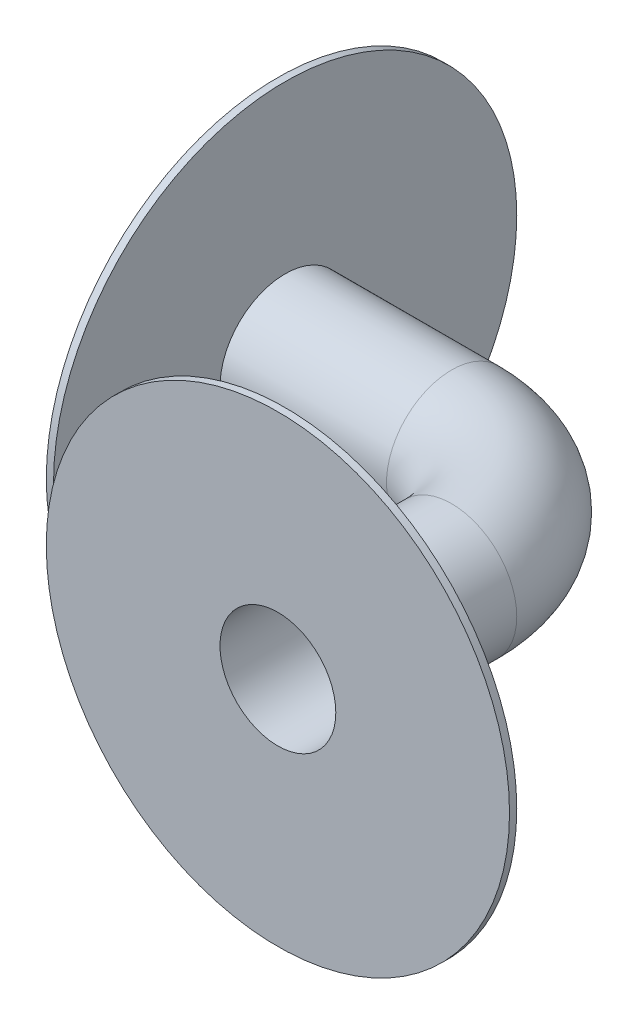
ISO-10303-21;
HEADER;
FILE_DESCRIPTION(('STEP AP214'),'2;1');
FILE_NAME('part.step','',(''),(''),'','','');
FILE_SCHEMA(('AUTOMOTIVE_DESIGN { 1 0 10303 214 1 1 1 1 }'));
ENDSEC;
DATA;
#1=APPLICATION_CONTEXT('core data for automotive mechanical design processes');
#2=APPLICATION_PROTOCOL_DEFINITION('international standard','automotive_design',2000,#1);
#3=PRODUCT_CONTEXT('',#1,'mechanical');
#4=PRODUCT('Part','Part','',(#3));
#5=PRODUCT_RELATED_PRODUCT_CATEGORY('part','',(#4));
#6=PRODUCT_DEFINITION_FORMATION('','',#4);
#7=PRODUCT_DEFINITION_CONTEXT('part definition',#1,'design');
#8=PRODUCT_DEFINITION('design','',#6,#7);
#9=PRODUCT_DEFINITION_SHAPE('','',#8);
#10=(LENGTH_UNIT() NAMED_UNIT(*) SI_UNIT(.MILLI.,.METRE.));
#11=(NAMED_UNIT(*) PLANE_ANGLE_UNIT() SI_UNIT($,.RADIAN.));
#12=(NAMED_UNIT(*) SI_UNIT($,.STERADIAN.) SOLID_ANGLE_UNIT());
#13=UNCERTAINTY_MEASURE_WITH_UNIT(LENGTH_MEASURE(1.E-05),#10,'distance_accuracy_value','');
#14=(GEOMETRIC_REPRESENTATION_CONTEXT(3) GLOBAL_UNCERTAINTY_ASSIGNED_CONTEXT((#13)) GLOBAL_UNIT_ASSIGNED_CONTEXT((#10,
#11,#12)) REPRESENTATION_CONTEXT('',''));
#15=CARTESIAN_POINT('',(0.,0.,0.));
#16=DIRECTION('',(0.,0.,1.));
#17=DIRECTION('',(1.,0.,0.));
#18=AXIS2_PLACEMENT_3D('',#15,#16,#17);
#19=CARTESIAN_POINT('',(25.4,0.,63.5));
#20=DIRECTION('',(0.,0.,-1.));
#21=DIRECTION('',(-1.,0.,0.));
#22=AXIS2_PLACEMENT_3D('',#19,#20,#21);
#23=CYLINDRICAL_SURFACE('',#22,14.2875);
#24=CARTESIAN_POINT('',(25.4,0.,25.4000000000001));
#25=DIRECTION('',(0.,0.,1.));
#26=DIRECTION('',(1.,0.,0.));
#27=AXIS2_PLACEMENT_3D('',#24,#25,#26);
#28=CIRCLE('',#27,14.2875);
#29=CARTESIAN_POINT('',(39.6875,0.,25.4000000000001));
#30=VERTEX_POINT('',#29);
#31=EDGE_CURVE('E33',#30,#30,#28,.T.);
#32=ORIENTED_EDGE('',*,*,#31,.T.);
#33=EDGE_LOOP('',(#32));
#34=FACE_BOUND('',#33,.T.);
#35=CARTESIAN_POINT('',(25.4,0.,61.9125));
#36=DIRECTION('',(0.,0.,1.));
#37=DIRECTION('',(1.,0.,0.));
#38=AXIS2_PLACEMENT_3D('',#35,#36,#37);
#39=CIRCLE('',#38,14.2875);
#40=CARTESIAN_POINT('',(39.6875,0.,61.9125));
#41=VERTEX_POINT('',#40);
#42=EDGE_CURVE('E10',#41,#41,#39,.T.);
#43=ORIENTED_EDGE('',*,*,#42,.F.);
#44=EDGE_LOOP('',(#43));
#45=FACE_BOUND('',#44,.T.);
#46=ADVANCED_FACE('F29',(#34,#45),#23,.T.);
#47=CARTESIAN_POINT('',(-38.1,0.,0.));
#48=DIRECTION('',(1.,0.,0.));
#49=DIRECTION('',(0.,0.,-1.));
#50=AXIS2_PLACEMENT_3D('',#47,#48,#49);
#51=CYLINDRICAL_SURFACE('',#50,14.2875);
#52=CARTESIAN_POINT('',(0.,0.,0.));
#53=DIRECTION('',(-1.,0.,0.));
#54=DIRECTION('',(0.,0.,1.));
#55=AXIS2_PLACEMENT_3D('',#52,#53,#54);
#56=CIRCLE('',#55,14.2875);
#57=CARTESIAN_POINT('',(0.,0.,-14.2875));
#58=VERTEX_POINT('',#57);
#59=EDGE_CURVE('E57',#58,#58,#56,.T.);
#60=CARTESIAN_POINT('',(-36.5125,0.,0.));
#61=DIRECTION('',(-1.,0.,0.));
#62=DIRECTION('',(0.,0.,1.));
#63=AXIS2_PLACEMENT_3D('',#60,#61,#62);
#64=CIRCLE('',#63,14.2875);
#65=CARTESIAN_POINT('',(-36.5125,0.,-14.2875));
#66=VERTEX_POINT('',#65);
#67=EDGE_CURVE('E37',#66,#66,#64,.T.);
#68=CARTESIAN_POINT('',(0.,0.,-14.2875));
#69=CARTESIAN_POINT('',(-0.380338541666666,0.,-14.2875));
#70=CARTESIAN_POINT('',(-0.760677083333332,0.,-14.2875));
#71=CARTESIAN_POINT('',(-1.52135416666666,0.,-14.2875));
#72=CARTESIAN_POINT('',(-1.90169270833333,0.,-14.2875));
#73=CARTESIAN_POINT('',(-2.66236979166667,0.,-14.2875));
#74=CARTESIAN_POINT('',(-3.04270833333333,0.,-14.2875));
#75=CARTESIAN_POINT('',(-3.80338541666667,0.,-14.2875));
#76=CARTESIAN_POINT('',(-4.18372395833333,0.,-14.2875));
#77=CARTESIAN_POINT('',(-4.94440104166667,0.,-14.2875));
#78=CARTESIAN_POINT('',(-5.32473958333333,0.,-14.2875));
#79=CARTESIAN_POINT('',(-6.08541666666667,0.,-14.2875));
#80=CARTESIAN_POINT('',(-6.46575520833334,0.,-14.2875));
#81=CARTESIAN_POINT('',(-7.22643229166667,0.,-14.2875));
#82=CARTESIAN_POINT('',(-7.60677083333333,0.,-14.2875));
#83=CARTESIAN_POINT('',(-8.36744791666666,0.,-14.2875));
#84=CARTESIAN_POINT('',(-8.74778645833333,0.,-14.2875));
#85=CARTESIAN_POINT('',(-9.50846354166666,0.,-14.2875));
#86=CARTESIAN_POINT('',(-9.88880208333333,0.,-14.2875));
#87=CARTESIAN_POINT('',(-10.6494791666667,0.,-14.2875));
#88=CARTESIAN_POINT('',(-11.0298177083333,0.,-14.2875));
#89=CARTESIAN_POINT('',(-11.7904947916667,0.,-14.2875));
#90=CARTESIAN_POINT('',(-12.1708333333333,0.,-14.2875));
#91=CARTESIAN_POINT('',(-12.9315104166667,0.,-14.2875));
#92=CARTESIAN_POINT('',(-13.3118489583333,0.,-14.2875));
#93=CARTESIAN_POINT('',(-14.0725260416667,0.,-14.2875));
#94=CARTESIAN_POINT('',(-14.4528645833333,0.,-14.2875));
#95=CARTESIAN_POINT('',(-15.2135416666667,0.,-14.2875));
#96=CARTESIAN_POINT('',(-15.5938802083333,0.,-14.2875));
#97=CARTESIAN_POINT('',(-16.3545572916667,0.,-14.2875));
#98=CARTESIAN_POINT('',(-16.7348958333333,0.,-14.2875));
#99=CARTESIAN_POINT('',(-17.4955729166667,0.,-14.2875));
#100=CARTESIAN_POINT('',(-17.8759114583333,0.,-14.2875));
#101=CARTESIAN_POINT('',(-18.6365885416667,0.,-14.2875));
#102=CARTESIAN_POINT('',(-19.0169270833333,0.,-14.2875));
#103=CARTESIAN_POINT('',(-19.7776041666667,0.,-14.2875));
#104=CARTESIAN_POINT('',(-20.1579427083333,0.,-14.2875));
#105=CARTESIAN_POINT('',(-20.9186197916667,0.,-14.2875));
#106=CARTESIAN_POINT('',(-21.2989583333333,0.,-14.2875));
#107=CARTESIAN_POINT('',(-22.0596354166667,0.,-14.2875));
#108=CARTESIAN_POINT('',(-22.4399739583333,0.,-14.2875));
#109=CARTESIAN_POINT('',(-23.2006510416667,0.,-14.2875));
#110=CARTESIAN_POINT('',(-23.5809895833333,0.,-14.2875));
#111=CARTESIAN_POINT('',(-24.3416666666667,0.,-14.2875));
#112=CARTESIAN_POINT('',(-24.7220052083333,0.,-14.2875));
#113=CARTESIAN_POINT('',(-25.4826822916667,0.,-14.2875));
#114=CARTESIAN_POINT('',(-25.8630208333333,0.,-14.2875));
#115=CARTESIAN_POINT('',(-26.6236979166667,0.,-14.2875));
#116=CARTESIAN_POINT('',(-27.0040364583333,0.,-14.2875));
#117=CARTESIAN_POINT('',(-27.7647135416667,0.,-14.2875));
#118=CARTESIAN_POINT('',(-28.1450520833333,0.,-14.2875));
#119=CARTESIAN_POINT('',(-28.9057291666667,0.,-14.2875));
#120=CARTESIAN_POINT('',(-29.2860677083333,0.,-14.2875));
#121=CARTESIAN_POINT('',(-30.0467447916667,0.,-14.2875));
#122=CARTESIAN_POINT('',(-30.4270833333333,0.,-14.2875));
#123=CARTESIAN_POINT('',(-31.1877604166667,0.,-14.2875));
#124=CARTESIAN_POINT('',(-31.5680989583333,0.,-14.2875));
#125=CARTESIAN_POINT('',(-32.3287760416667,0.,-14.2875));
#126=CARTESIAN_POINT('',(-32.7091145833333,0.,-14.2875));
#127=CARTESIAN_POINT('',(-33.4697916666667,0.,-14.2875));
#128=CARTESIAN_POINT('',(-33.8501302083333,0.,-14.2875));
#129=CARTESIAN_POINT('',(-34.6108072916667,0.,-14.2875));
#130=CARTESIAN_POINT('',(-34.9911458333333,0.,-14.2875));
#131=CARTESIAN_POINT('',(-35.7518229166667,0.,-14.2875));
#132=CARTESIAN_POINT('',(-36.1321614583333,0.,-14.2875));
#133=CARTESIAN_POINT('',(-36.5125,0.,-14.2875));
#134=B_SPLINE_CURVE_WITH_KNOTS('',3,(#68,#69,#70,#71,#72,#73,#74,#75,#76,#77,#78,#79,#80,#81,
#82,#83,#84,#85,#86,#87,#88,#89,#90,#91,#92,#93,#94,#95,#96,#97,#98,#99,#100,#101,#102,#103,
#104,#105,#106,#107,#108,#109,#110,#111,#112,#113,#114,#115,#116,#117,#118,#119,#120,#121,#122,
#123,#124,#125,#126,#127,#128,#129,#130,#131,#132,#133),.UNSPECIFIED.,.F.,.F.,(4,2,2,2,2,2,2,2,
2,2,2,2,2,2,2,2,2,2,2,2,2,2,2,2,2,2,2,2,2,2,2,2,4),(0.,1.141015625,2.28203125,3.423046875,
4.5640625,5.705078125,6.84609375,7.987109375,9.128125,10.269140625,11.41015625,12.551171875,
13.6921875,14.833203125,15.97421875,17.115234375,18.25625,19.397265625,20.53828125,21.679296875,
22.8203125,23.961328125,25.10234375,26.243359375,27.384375,28.525390625,29.66640625,
30.807421875,31.9484375,33.089453125,34.23046875,35.371484375,36.5125),.UNSPECIFIED.);
#135=EDGE_CURVE('BSEAM80',#58,#66,#134,.T.);
#136=ORIENTED_EDGE('',*,*,#59,.T.);
#137=ORIENTED_EDGE('',*,*,#67,.F.);
#138=ORIENTED_EDGE('',*,*,#135,.T.);
#139=ORIENTED_EDGE('',*,*,#135,.F.);
#140=EDGE_LOOP('',(#136,#138,#137,#139));
#141=FACE_BOUND('',#140,.T.);
#142=ADVANCED_FACE('F80',(#141),#51,.T.);
#143=CARTESIAN_POINT('',(0.,0.,25.4));
#144=DIRECTION('',(0.,1.,0.));
#145=DIRECTION('',(0.,0.,1.));
#146=AXIS2_PLACEMENT_3D('',#143,#144,#145);
#147=TOROIDAL_SURFACE('',#146,25.4,12.7);
#148=CARTESIAN_POINT('',(25.4,0.,25.4));
#149=DIRECTION('',(0.,0.,1.));
#150=DIRECTION('',(1.,0.,0.));
#151=AXIS2_PLACEMENT_3D('',#148,#149,#150);
#152=CIRCLE('',#151,12.7);
#153=CARTESIAN_POINT('',(38.1,0.,25.4));
#154=VERTEX_POINT('',#153);
#155=EDGE_CURVE('E60',#154,#154,#152,.T.);
#156=CARTESIAN_POINT('',(0.,0.,0.));
#157=DIRECTION('',(1.,0.,0.));
#158=DIRECTION('',(0.,0.,-1.));
#159=AXIS2_PLACEMENT_3D('',#156,#157,#158);
#160=CIRCLE('',#159,12.7);
#161=CARTESIAN_POINT('',(0.,0.,-12.7));
#162=VERTEX_POINT('',#161);
#163=EDGE_CURVE('E64',#162,#162,#160,.T.);
#164=CARTESIAN_POINT('',(0.,0.,25.4));
#165=DIRECTION('',(0.,1.,0.));
#166=DIRECTION('',(0.,0.,1.));
#167=AXIS2_PLACEMENT_3D('',#164,#165,#166);
#168=CIRCLE('',#167,38.1);
#169=EDGE_CURVE('',#154,#162,#168,.T.);
#170=ORIENTED_EDGE('',*,*,#155,.T.);
#171=ORIENTED_EDGE('',*,*,#163,.F.);
#172=ORIENTED_EDGE('',*,*,#169,.T.);
#173=ORIENTED_EDGE('',*,*,#169,.F.);
#174=EDGE_LOOP('',(#170,#172,#171,#173));
#175=FACE_BOUND('',#174,.T.);
#176=ADVANCED_FACE('F77',(#175),#147,.F.);
#177=CARTESIAN_POINT('',(0.,0.,25.4));
#178=DIRECTION('',(0.,1.,0.));
#179=DIRECTION('',(0.,0.,1.));
#180=AXIS2_PLACEMENT_3D('',#177,#178,#179);
#181=TOROIDAL_SURFACE('',#180,25.4,14.2875);
#182=CARTESIAN_POINT('',(0.,0.,25.4));
#183=DIRECTION('',(0.,1.,0.));
#184=DIRECTION('',(0.,0.,1.));
#185=AXIS2_PLACEMENT_3D('',#182,#183,#184);
#186=CIRCLE('',#185,39.6875);
#187=EDGE_CURVE('',#30,#58,#186,.T.);
#188=ORIENTED_EDGE('',*,*,#31,.F.);
#189=ORIENTED_EDGE('',*,*,#59,.F.);
#190=ORIENTED_EDGE('',*,*,#187,.T.);
#191=ORIENTED_EDGE('',*,*,#187,.F.);
#192=EDGE_LOOP('',(#188,#190,#189,#191));
#193=FACE_BOUND('',#192,.T.);
#194=ADVANCED_FACE('F31',(#193),#181,.T.);
#195=CARTESIAN_POINT('',(25.4,0.,63.5));
#196=DIRECTION('',(0.,0.,1.));
#197=DIRECTION('',(1.,0.,0.));
#198=AXIS2_PLACEMENT_3D('',#195,#196,#197);
#199=PLANE('',#198);
#200=CARTESIAN_POINT('',(25.4,0.,63.5));
#201=DIRECTION('',(0.,0.,1.));
#202=DIRECTION('',(1.,0.,0.));
#203=AXIS2_PLACEMENT_3D('',#200,#201,#202);
#204=CIRCLE('',#203,12.7);
#205=CARTESIAN_POINT('',(38.1,0.,63.5));
#206=VERTEX_POINT('',#205);
#207=EDGE_CURVE('E61',#206,#206,#204,.T.);
#208=ORIENTED_EDGE('',*,*,#207,.F.);
#209=EDGE_LOOP('',(#208));
#210=FACE_BOUND('',#209,.T.);
#211=CARTESIAN_POINT('',(25.4,0.,63.5));
#212=DIRECTION('',(0.,0.,1.));
#213=DIRECTION('',(1.,0.,0.));
#214=AXIS2_PLACEMENT_3D('',#211,#212,#213);
#215=CIRCLE('',#214,50.8);
#216=CARTESIAN_POINT('',(76.2,0.,63.5));
#217=VERTEX_POINT('',#216);
#218=EDGE_CURVE('E45',#217,#217,#215,.T.);
#219=ORIENTED_EDGE('',*,*,#218,.T.);
#220=EDGE_LOOP('',(#219));
#221=FACE_BOUND('',#220,.T.);
#222=ADVANCED_FACE('F76',(#210,#221),#199,.T.);
#223=CARTESIAN_POINT('',(25.4,0.,63.5));
#224=DIRECTION('',(0.,0.,-1.));
#225=DIRECTION('',(-1.,0.,0.));
#226=AXIS2_PLACEMENT_3D('',#223,#224,#225);
#227=CYLINDRICAL_SURFACE('',#226,12.7);
#228=ORIENTED_EDGE('',*,*,#207,.T.);
#229=EDGE_LOOP('',(#228));
#230=FACE_BOUND('',#229,.T.);
#231=ORIENTED_EDGE('',*,*,#155,.F.);
#232=EDGE_LOOP('',(#231));
#233=FACE_BOUND('',#232,.T.);
#234=ADVANCED_FACE('F117',(#230,#233),#227,.F.);
#235=CARTESIAN_POINT('',(-38.1,0.,0.));
#236=DIRECTION('',(-1.,0.,0.));
#237=DIRECTION('',(0.,0.,1.));
#238=AXIS2_PLACEMENT_3D('',#235,#236,#237);
#239=PLANE('',#238);
#240=CARTESIAN_POINT('',(-38.1,0.,0.));
#241=DIRECTION('',(-1.,0.,0.));
#242=DIRECTION('',(0.,0.,1.));
#243=AXIS2_PLACEMENT_3D('',#240,#241,#242);
#244=CIRCLE('',#243,12.7);
#245=CARTESIAN_POINT('',(-38.1,0.,-12.7));
#246=VERTEX_POINT('',#245);
#247=EDGE_CURVE('E50',#246,#246,#244,.T.);
#248=ORIENTED_EDGE('',*,*,#247,.F.);
#249=EDGE_LOOP('',(#248));
#250=FACE_BOUND('',#249,.T.);
#251=CARTESIAN_POINT('',(-38.1,0.,0.));
#252=DIRECTION('',(-1.,0.,0.));
#253=DIRECTION('',(0.,0.,1.));
#254=AXIS2_PLACEMENT_3D('',#251,#252,#253);
#255=CIRCLE('',#254,50.8);
#256=CARTESIAN_POINT('',(-38.1,0.,50.8));
#257=VERTEX_POINT('',#256);
#258=EDGE_CURVE('E51',#257,#257,#255,.T.);
#259=ORIENTED_EDGE('',*,*,#258,.T.);
#260=EDGE_LOOP('',(#259));
#261=FACE_BOUND('',#260,.T.);
#262=ADVANCED_FACE('F99',(#250,#261),#239,.T.);
#263=CARTESIAN_POINT('',(-38.1,0.,0.));
#264=DIRECTION('',(1.,0.,0.));
#265=DIRECTION('',(0.,0.,-1.));
#266=AXIS2_PLACEMENT_3D('',#263,#264,#265);
#267=CYLINDRICAL_SURFACE('',#266,12.7);
#268=CARTESIAN_POINT('',(-38.1,0.,-12.7));
#269=CARTESIAN_POINT('',(-37.703125,0.,-12.7));
#270=CARTESIAN_POINT('',(-37.30625,0.,-12.7));
#271=CARTESIAN_POINT('',(-36.5125,0.,-12.7));
#272=CARTESIAN_POINT('',(-36.115625,0.,-12.7));
#273=CARTESIAN_POINT('',(-35.321875,0.,-12.7));
#274=CARTESIAN_POINT('',(-34.925,0.,-12.7));
#275=CARTESIAN_POINT('',(-34.13125,0.,-12.7));
#276=CARTESIAN_POINT('',(-33.734375,0.,-12.7));
#277=CARTESIAN_POINT('',(-32.940625,0.,-12.7));
#278=CARTESIAN_POINT('',(-32.54375,0.,-12.7));
#279=CARTESIAN_POINT('',(-31.75,0.,-12.7));
#280=CARTESIAN_POINT('',(-31.353125,0.,-12.7));
#281=CARTESIAN_POINT('',(-30.559375,0.,-12.7));
#282=CARTESIAN_POINT('',(-30.1625,0.,-12.7));
#283=CARTESIAN_POINT('',(-29.36875,0.,-12.7));
#284=CARTESIAN_POINT('',(-28.971875,0.,-12.7));
#285=CARTESIAN_POINT('',(-28.178125,0.,-12.7));
#286=CARTESIAN_POINT('',(-27.78125,0.,-12.7));
#287=CARTESIAN_POINT('',(-26.9875,0.,-12.7));
#288=CARTESIAN_POINT('',(-26.590625,0.,-12.7));
#289=CARTESIAN_POINT('',(-25.796875,0.,-12.7));
#290=CARTESIAN_POINT('',(-25.4,0.,-12.7));
#291=CARTESIAN_POINT('',(-24.60625,0.,-12.7));
#292=CARTESIAN_POINT('',(-24.209375,0.,-12.7));
#293=CARTESIAN_POINT('',(-23.415625,0.,-12.7));
#294=CARTESIAN_POINT('',(-23.01875,0.,-12.7));
#295=CARTESIAN_POINT('',(-22.225,0.,-12.7));
#296=CARTESIAN_POINT('',(-21.828125,0.,-12.7));
#297=CARTESIAN_POINT('',(-21.034375,0.,-12.7));
#298=CARTESIAN_POINT('',(-20.6375,0.,-12.7));
#299=CARTESIAN_POINT('',(-19.84375,0.,-12.7));
#300=CARTESIAN_POINT('',(-19.446875,0.,-12.7));
#301=CARTESIAN_POINT('',(-18.653125,0.,-12.7));
#302=CARTESIAN_POINT('',(-18.25625,0.,-12.7));
#303=CARTESIAN_POINT('',(-17.4625,0.,-12.7));
#304=CARTESIAN_POINT('',(-17.065625,0.,-12.7));
#305=CARTESIAN_POINT('',(-16.271875,0.,-12.7));
#306=CARTESIAN_POINT('',(-15.875,0.,-12.7));
#307=CARTESIAN_POINT('',(-15.08125,0.,-12.7));
#308=CARTESIAN_POINT('',(-14.684375,0.,-12.7));
#309=CARTESIAN_POINT('',(-13.890625,0.,-12.7));
#310=CARTESIAN_POINT('',(-13.49375,0.,-12.7));
#311=CARTESIAN_POINT('',(-12.7,0.,-12.7));
#312=CARTESIAN_POINT('',(-12.303125,0.,-12.7));
#313=CARTESIAN_POINT('',(-11.509375,0.,-12.7));
#314=CARTESIAN_POINT('',(-11.1125,0.,-12.7));
#315=CARTESIAN_POINT('',(-10.31875,0.,-12.7));
#316=CARTESIAN_POINT('',(-9.92187499999999,0.,-12.7));
#317=CARTESIAN_POINT('',(-9.128125,0.,-12.7));
#318=CARTESIAN_POINT('',(-8.73124999999999,0.,-12.7));
#319=CARTESIAN_POINT('',(-7.93749999999999,0.,-12.7));
#320=CARTESIAN_POINT('',(-7.54062499999999,0.,-12.7));
#321=CARTESIAN_POINT('',(-6.746875,0.,-12.7));
#322=CARTESIAN_POINT('',(-6.35,0.,-12.7));
#323=CARTESIAN_POINT('',(-5.55625,0.,-12.7));
#324=CARTESIAN_POINT('',(-5.159375,0.,-12.7));
#325=CARTESIAN_POINT('',(-4.365625,0.,-12.7));
#326=CARTESIAN_POINT('',(-3.96875,0.,-12.7));
#327=CARTESIAN_POINT('',(-3.175,0.,-12.7));
#328=CARTESIAN_POINT('',(-2.778125,0.,-12.7));
#329=CARTESIAN_POINT('',(-1.984375,0.,-12.7));
#330=CARTESIAN_POINT('',(-1.5875,0.,-12.7));
#331=CARTESIAN_POINT('',(-0.79375,0.,-12.7));
#332=CARTESIAN_POINT('',(-0.396875,0.,-12.7));
#333=CARTESIAN_POINT('',(0.,0.,-12.7));
#334=B_SPLINE_CURVE_WITH_KNOTS('',3,(#268,#269,#270,#271,#272,#273,#274,#275,#276,#277,#278,
#279,#280,#281,#282,#283,#284,#285,#286,#287,#288,#289,#290,#291,#292,#293,#294,#295,#296,#297,
#298,#299,#300,#301,#302,#303,#304,#305,#306,#307,#308,#309,#310,#311,#312,#313,#314,#315,#316,
#317,#318,#319,#320,#321,#322,#323,#324,#325,#326,#327,#328,#329,#330,#331,#332,#333),
.UNSPECIFIED.,.F.,.F.,(4,2,2,2,2,2,2,2,2,2,2,2,2,2,2,2,2,2,2,2,2,2,2,2,2,2,2,2,2,2,2,2,4),(0.,
1.190625,2.38125,3.571875,4.7625,5.953125,7.14375,8.334375,9.52500000000001,10.715625,11.90625,
13.096875,14.2875,15.478125,16.66875,17.859375,19.05,20.240625,21.43125,22.621875,23.8125,
25.003125,26.19375,27.384375,28.575,29.765625,30.95625,32.146875,33.3375,34.528125,35.71875,
36.909375,38.1),.UNSPECIFIED.);
#335=EDGE_CURVE('BSEAM89',#246,#162,#334,.T.);
#336=ORIENTED_EDGE('',*,*,#247,.T.);
#337=ORIENTED_EDGE('',*,*,#163,.T.);
#338=ORIENTED_EDGE('',*,*,#335,.T.);
#339=ORIENTED_EDGE('',*,*,#335,.F.);
#340=EDGE_LOOP('',(#336,#338,#337,#339));
#341=FACE_BOUND('',#340,.T.);
#342=ADVANCED_FACE('F89',(#341),#267,.F.);
#343=CARTESIAN_POINT('',(-36.5125,0.,0.));
#344=DIRECTION('',(-1.,0.,0.));
#345=DIRECTION('',(0.,0.,1.));
#346=AXIS2_PLACEMENT_3D('',#343,#344,#345);
#347=PLANE('',#346);
#348=CARTESIAN_POINT('',(-36.5125,0.,0.));
#349=DIRECTION('',(-1.,0.,0.));
#350=DIRECTION('',(0.,0.,1.));
#351=AXIS2_PLACEMENT_3D('',#348,#349,#350);
#352=CIRCLE('',#351,50.8);
#353=CARTESIAN_POINT('',(-36.5125,0.,50.8));
#354=VERTEX_POINT('',#353);
#355=EDGE_CURVE('E47',#354,#354,#352,.T.);
#356=ORIENTED_EDGE('',*,*,#355,.F.);
#357=EDGE_LOOP('',(#356));
#358=FACE_BOUND('',#357,.T.);
#359=ORIENTED_EDGE('',*,*,#67,.T.);
#360=EDGE_LOOP('',(#359));
#361=FACE_BOUND('',#360,.T.);
#362=ADVANCED_FACE('F86',(#358,#361),#347,.F.);
#363=CARTESIAN_POINT('',(-36.5125,0.,0.));
#364=DIRECTION('',(-1.,0.,0.));
#365=DIRECTION('',(0.,0.,1.));
#366=AXIS2_PLACEMENT_3D('',#363,#364,#365);
#367=CYLINDRICAL_SURFACE('',#366,50.8);
#368=ORIENTED_EDGE('',*,*,#355,.T.);
#369=EDGE_LOOP('',(#368));
#370=FACE_BOUND('',#369,.T.);
#371=ORIENTED_EDGE('',*,*,#258,.F.);
#372=EDGE_LOOP('',(#371));
#373=FACE_BOUND('',#372,.T.);
#374=ADVANCED_FACE('F88',(#370,#373),#367,.T.);
#375=CARTESIAN_POINT('',(25.4,0.,61.9125));
#376=DIRECTION('',(0.,0.,1.));
#377=DIRECTION('',(1.,0.,0.));
#378=AXIS2_PLACEMENT_3D('',#375,#376,#377);
#379=PLANE('',#378);
#380=CARTESIAN_POINT('',(25.4,0.,61.9125));
#381=DIRECTION('',(0.,0.,1.));
#382=DIRECTION('',(1.,0.,0.));
#383=AXIS2_PLACEMENT_3D('',#380,#381,#382);
#384=CIRCLE('',#383,50.8);
#385=CARTESIAN_POINT('',(76.2,0.,61.9125));
#386=VERTEX_POINT('',#385);
#387=EDGE_CURVE('E53',#386,#386,#384,.T.);
#388=ORIENTED_EDGE('',*,*,#387,.F.);
#389=EDGE_LOOP('',(#388));
#390=FACE_BOUND('',#389,.T.);
#391=ORIENTED_EDGE('',*,*,#42,.T.);
#392=EDGE_LOOP('',(#391));
#393=FACE_BOUND('',#392,.T.);
#394=ADVANCED_FACE('F96',(#390,#393),#379,.F.);
#395=CARTESIAN_POINT('',(25.4,0.,61.9125));
#396=DIRECTION('',(0.,0.,1.));
#397=DIRECTION('',(1.,0.,0.));
#398=AXIS2_PLACEMENT_3D('',#395,#396,#397);
#399=CYLINDRICAL_SURFACE('',#398,50.8);
#400=ORIENTED_EDGE('',*,*,#387,.T.);
#401=EDGE_LOOP('',(#400));
#402=FACE_BOUND('',#401,.T.);
#403=ORIENTED_EDGE('',*,*,#218,.F.);
#404=EDGE_LOOP('',(#403));
#405=FACE_BOUND('',#404,.T.);
#406=ADVANCED_FACE('F135',(#402,#405),#399,.T.);
#407=CLOSED_SHELL('',(#46,#142,#176,#194,#222,#234,#262,#342,#362,#374,#394,#406));
#408=MANIFOLD_SOLID_BREP('B2',#407);
#409=ADVANCED_BREP_SHAPE_REPRESENTATION('',(#18,#408),#14);
#410=SHAPE_DEFINITION_REPRESENTATION(#9,#409);
ENDSEC;
END-ISO-10303-21;
